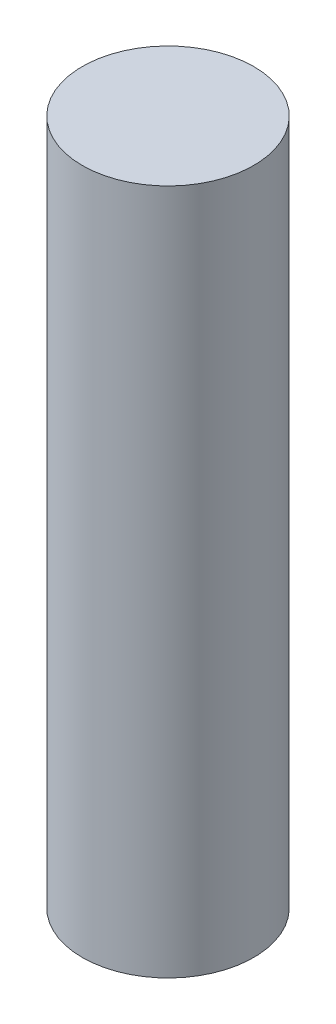
ISO-10303-21;
HEADER;
FILE_DESCRIPTION(('STEP AP214'),'2;1');
FILE_NAME('part.step','',(''),(''),'','','');
FILE_SCHEMA(('AUTOMOTIVE_DESIGN { 1 0 10303 214 1 1 1 1 }'));
ENDSEC;
DATA;
#1=APPLICATION_CONTEXT('core data for automotive mechanical design processes');
#2=APPLICATION_PROTOCOL_DEFINITION('international standard','automotive_design',2000,#1);
#3=PRODUCT_CONTEXT('',#1,'mechanical');
#4=PRODUCT('Part','Part','',(#3));
#5=PRODUCT_RELATED_PRODUCT_CATEGORY('part','',(#4));
#6=PRODUCT_DEFINITION_FORMATION('','',#4);
#7=PRODUCT_DEFINITION_CONTEXT('part definition',#1,'design');
#8=PRODUCT_DEFINITION('design','',#6,#7);
#9=PRODUCT_DEFINITION_SHAPE('','',#8);
#10=(LENGTH_UNIT() NAMED_UNIT(*) SI_UNIT(.MILLI.,.METRE.));
#11=(NAMED_UNIT(*) PLANE_ANGLE_UNIT() SI_UNIT($,.RADIAN.));
#12=(NAMED_UNIT(*) SI_UNIT($,.STERADIAN.) SOLID_ANGLE_UNIT());
#13=UNCERTAINTY_MEASURE_WITH_UNIT(LENGTH_MEASURE(1.E-05),#10,'distance_accuracy_value','');
#14=(GEOMETRIC_REPRESENTATION_CONTEXT(3) GLOBAL_UNCERTAINTY_ASSIGNED_CONTEXT((#13)) GLOBAL_UNIT_ASSIGNED_CONTEXT((#10,
#11,#12)) REPRESENTATION_CONTEXT('',''));
#15=CARTESIAN_POINT('',(0.,0.,0.));
#16=DIRECTION('',(0.,0.,1.));
#17=DIRECTION('',(1.,0.,0.));
#18=AXIS2_PLACEMENT_3D('',#15,#16,#17);
#19=CARTESIAN_POINT('',(0.,24.,0.));
#20=DIRECTION('',(0.,-1.,0.));
#21=DIRECTION('',(0.,0.,-1.));
#22=AXIS2_PLACEMENT_3D('',#19,#20,#21);
#23=CYLINDRICAL_SURFACE('',#22,3.);
#24=CARTESIAN_POINT('',(0.,24.,0.));
#25=DIRECTION('',(0.,1.,0.));
#26=DIRECTION('',(0.,0.,1.));
#27=AXIS2_PLACEMENT_3D('',#24,#25,#26);
#28=CIRCLE('',#27,3.);
#29=CARTESIAN_POINT('',(0.,24.,3.));
#30=VERTEX_POINT('',#29);
#31=EDGE_CURVE('E10',#30,#30,#28,.T.);
#32=ORIENTED_EDGE('',*,*,#31,.F.);
#33=EDGE_LOOP('',(#32));
#34=FACE_BOUND('',#33,.T.);
#35=CARTESIAN_POINT('',(0.,0.,0.));
#36=DIRECTION('',(0.,1.,0.));
#37=DIRECTION('',(0.,0.,1.));
#38=AXIS2_PLACEMENT_3D('',#35,#36,#37);
#39=CIRCLE('',#38,3.);
#40=CARTESIAN_POINT('',(0.,0.,3.));
#41=VERTEX_POINT('',#40);
#42=EDGE_CURVE('E34',#41,#41,#39,.T.);
#43=ORIENTED_EDGE('',*,*,#42,.T.);
#44=EDGE_LOOP('',(#43));
#45=FACE_BOUND('',#44,.T.);
#46=ADVANCED_FACE('F31',(#34,#45),#23,.T.);
#47=CARTESIAN_POINT('',(0.,24.,0.));
#48=DIRECTION('',(0.,1.,0.));
#49=DIRECTION('',(0.,0.,1.));
#50=AXIS2_PLACEMENT_3D('',#47,#48,#49);
#51=PLANE('',#50);
#52=ORIENTED_EDGE('',*,*,#31,.T.);
#53=EDGE_LOOP('',(#52));
#54=FACE_BOUND('',#53,.T.);
#55=ADVANCED_FACE('F46',(#54),#51,.T.);
#56=CARTESIAN_POINT('',(0.,0.,0.));
#57=DIRECTION('',(0.,1.,0.));
#58=DIRECTION('',(0.,0.,1.));
#59=AXIS2_PLACEMENT_3D('',#56,#57,#58);
#60=PLANE('',#59);
#61=ORIENTED_EDGE('',*,*,#42,.F.);
#62=EDGE_LOOP('',(#61));
#63=FACE_BOUND('',#62,.T.);
#64=ADVANCED_FACE('F44',(#63),#60,.F.);
#65=CLOSED_SHELL('',(#46,#55,#64));
#66=MANIFOLD_SOLID_BREP('B2',#65);
#67=ADVANCED_BREP_SHAPE_REPRESENTATION('',(#18,#66),#14);
#68=SHAPE_DEFINITION_REPRESENTATION(#9,#67);
ENDSEC;
END-ISO-10303-21;
